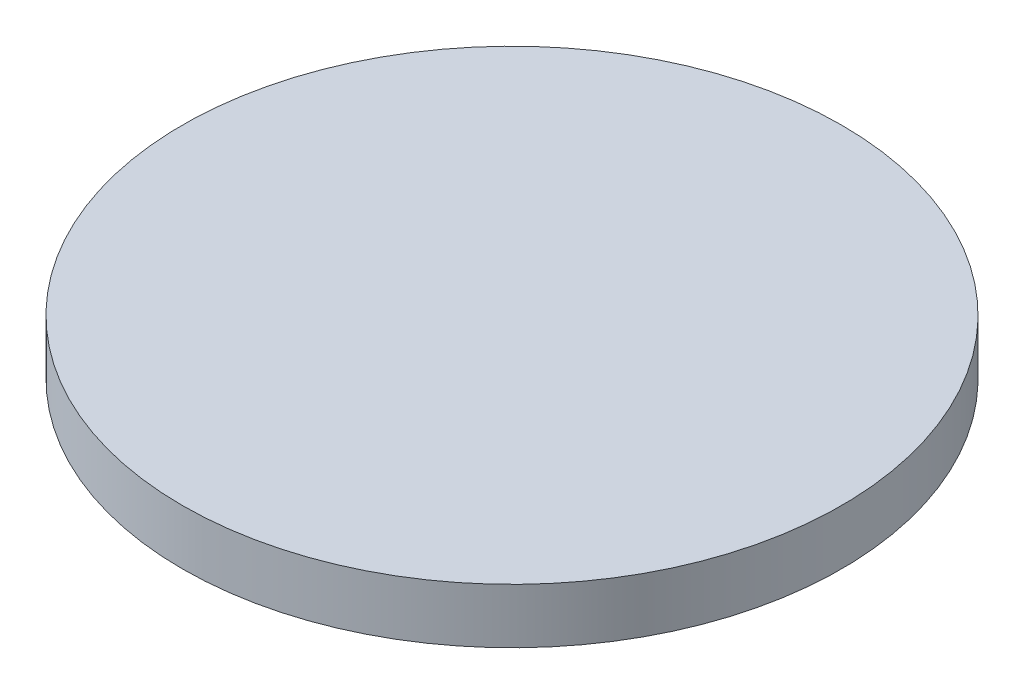
ISO-10303-21;
HEADER;
FILE_DESCRIPTION(('STEP AP214'),'2;1');
FILE_NAME('part.step','',(''),(''),'','','');
FILE_SCHEMA(('AUTOMOTIVE_DESIGN { 1 0 10303 214 1 1 1 1 }'));
ENDSEC;
DATA;
#1=APPLICATION_CONTEXT('core data for automotive mechanical design processes');
#2=APPLICATION_PROTOCOL_DEFINITION('international standard','automotive_design',2000,#1);
#3=PRODUCT_CONTEXT('',#1,'mechanical');
#4=PRODUCT('Part','Part','',(#3));
#5=PRODUCT_RELATED_PRODUCT_CATEGORY('part','',(#4));
#6=PRODUCT_DEFINITION_FORMATION('','',#4);
#7=PRODUCT_DEFINITION_CONTEXT('part definition',#1,'design');
#8=PRODUCT_DEFINITION('design','',#6,#7);
#9=PRODUCT_DEFINITION_SHAPE('','',#8);
#10=(LENGTH_UNIT() NAMED_UNIT(*) SI_UNIT(.MILLI.,.METRE.));
#11=(NAMED_UNIT(*) PLANE_ANGLE_UNIT() SI_UNIT($,.RADIAN.));
#12=(NAMED_UNIT(*) SI_UNIT($,.STERADIAN.) SOLID_ANGLE_UNIT());
#13=UNCERTAINTY_MEASURE_WITH_UNIT(LENGTH_MEASURE(1.E-05),#10,'distance_accuracy_value','');
#14=(GEOMETRIC_REPRESENTATION_CONTEXT(3) GLOBAL_UNCERTAINTY_ASSIGNED_CONTEXT((#13)) GLOBAL_UNIT_ASSIGNED_CONTEXT((#10,
#11,#12)) REPRESENTATION_CONTEXT('',''));
#15=CARTESIAN_POINT('',(0.,0.,0.));
#16=DIRECTION('',(0.,0.,1.));
#17=DIRECTION('',(1.,0.,0.));
#18=AXIS2_PLACEMENT_3D('',#15,#16,#17);
#19=CARTESIAN_POINT('',(0.,0.,0.));
#20=DIRECTION('',(0.,1.,0.));
#21=DIRECTION('',(0.,0.,1.));
#22=AXIS2_PLACEMENT_3D('',#19,#20,#21);
#23=PLANE('',#22);
#24=CARTESIAN_POINT('',(0.,0.,0.));
#25=DIRECTION('',(0.,1.,0.));
#26=DIRECTION('',(0.,0.,1.));
#27=AXIS2_PLACEMENT_3D('',#24,#25,#26);
#28=CIRCLE('',#27,38.1);
#29=CARTESIAN_POINT('',(0.,0.,38.1));
#30=VERTEX_POINT('',#29);
#31=EDGE_CURVE('E10',#30,#30,#28,.T.);
#32=ORIENTED_EDGE('',*,*,#31,.F.);
#33=EDGE_LOOP('',(#32));
#34=FACE_BOUND('',#33,.T.);
#35=ADVANCED_FACE('F37',(#34),#23,.F.);
#36=CARTESIAN_POINT('',(0.,0.,0.));
#37=DIRECTION('',(0.,1.,0.));
#38=DIRECTION('',(0.,0.,1.));
#39=AXIS2_PLACEMENT_3D('',#36,#37,#38);
#40=CYLINDRICAL_SURFACE('',#39,38.1);
#41=CARTESIAN_POINT('',(0.,6.35,0.));
#42=DIRECTION('',(0.,1.,0.));
#43=DIRECTION('',(0.,0.,1.));
#44=AXIS2_PLACEMENT_3D('',#41,#42,#43);
#45=CIRCLE('',#44,38.1);
#46=CARTESIAN_POINT('',(0.,6.35,38.1));
#47=VERTEX_POINT('',#46);
#48=EDGE_CURVE('E44',#47,#47,#45,.T.);
#49=ORIENTED_EDGE('',*,*,#48,.F.);
#50=EDGE_LOOP('',(#49));
#51=FACE_BOUND('',#50,.T.);
#52=ORIENTED_EDGE('',*,*,#31,.T.);
#53=EDGE_LOOP('',(#52));
#54=FACE_BOUND('',#53,.T.);
#55=ADVANCED_FACE('F53',(#51,#54),#40,.T.);
#56=CARTESIAN_POINT('',(38.1,6.35,0.));
#57=DIRECTION('',(0.,-1.,0.));
#58=DIRECTION('',(0.,0.,-1.));
#59=AXIS2_PLACEMENT_3D('',#56,#57,#58);
#60=PLANE('',#59);
#61=ORIENTED_EDGE('',*,*,#48,.T.);
#62=EDGE_LOOP('',(#61));
#63=FACE_BOUND('',#62,.T.);
#64=ADVANCED_FACE('F51',(#63),#60,.F.);
#65=CLOSED_SHELL('',(#35,#55,#64));
#66=MANIFOLD_SOLID_BREP('B2',#65);
#67=ADVANCED_BREP_SHAPE_REPRESENTATION('',(#18,#66),#14);
#68=SHAPE_DEFINITION_REPRESENTATION(#9,#67);
ENDSEC;
END-ISO-10303-21;
